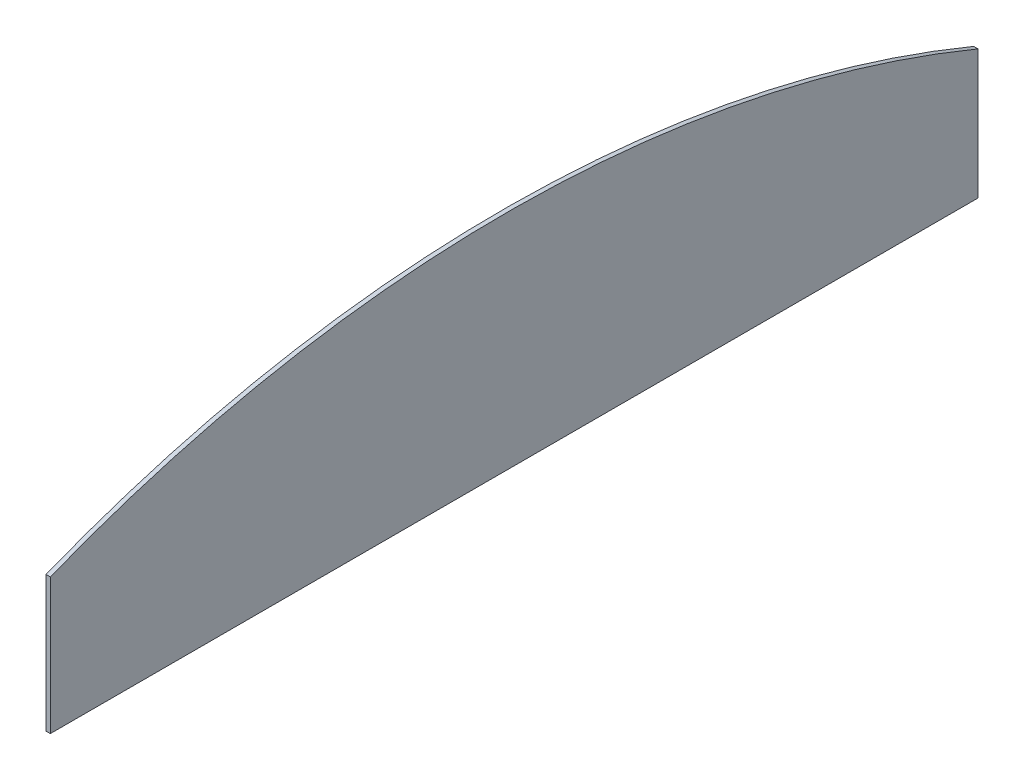
ISO-10303-21;
HEADER;
FILE_DESCRIPTION(('STEP AP214'),'2;1');
FILE_NAME('part.step','',(''),(''),'','','');
FILE_SCHEMA(('AUTOMOTIVE_DESIGN { 1 0 10303 214 1 1 1 1 }'));
ENDSEC;
DATA;
#1=APPLICATION_CONTEXT('core data for automotive mechanical design processes');
#2=APPLICATION_PROTOCOL_DEFINITION('international standard','automotive_design',2000,#1);
#3=PRODUCT_CONTEXT('',#1,'mechanical');
#4=PRODUCT('Part','Part','',(#3));
#5=PRODUCT_RELATED_PRODUCT_CATEGORY('part','',(#4));
#6=PRODUCT_DEFINITION_FORMATION('','',#4);
#7=PRODUCT_DEFINITION_CONTEXT('part definition',#1,'design');
#8=PRODUCT_DEFINITION('design','',#6,#7);
#9=PRODUCT_DEFINITION_SHAPE('','',#8);
#10=(LENGTH_UNIT() NAMED_UNIT(*) SI_UNIT(.MILLI.,.METRE.));
#11=(NAMED_UNIT(*) PLANE_ANGLE_UNIT() SI_UNIT($,.RADIAN.));
#12=(NAMED_UNIT(*) SI_UNIT($,.STERADIAN.) SOLID_ANGLE_UNIT());
#13=UNCERTAINTY_MEASURE_WITH_UNIT(LENGTH_MEASURE(1.E-05),#10,'distance_accuracy_value','');
#14=(GEOMETRIC_REPRESENTATION_CONTEXT(3) GLOBAL_UNCERTAINTY_ASSIGNED_CONTEXT((#13)) GLOBAL_UNIT_ASSIGNED_CONTEXT((#10,
#11,#12)) REPRESENTATION_CONTEXT('',''));
#15=CARTESIAN_POINT('',(0.,0.,0.));
#16=DIRECTION('',(0.,0.,1.));
#17=DIRECTION('',(1.,0.,0.));
#18=AXIS2_PLACEMENT_3D('',#15,#16,#17);
#19=CARTESIAN_POINT('',(1.5,348.032089202536,-162.774566473988));
#20=DIRECTION('',(0.,0.,1.));
#21=DIRECTION('',(0.,-1.,0.));
#22=AXIS2_PLACEMENT_3D('',#19,#20,#21);
#23=PLANE('',#22);
#24=DIRECTION('',(0.,1.,0.));
#25=VECTOR('',#24,1.);
#26=CARTESIAN_POINT('',(0.,348.032089202536,-162.774566473988));
#27=LINE('',#26,#25);
#28=CARTESIAN_POINT('',(0.,348.032089202536,-162.774566473988));
#29=VERTEX_POINT('',#28);
#30=CARTESIAN_POINT('',(0.,392.593225246189,-162.774566473988));
#31=VERTEX_POINT('',#30);
#32=EDGE_CURVE('E95',#29,#31,#27,.T.);
#33=ORIENTED_EDGE('',*,*,#32,.T.);
#34=DIRECTION('',(-1.,0.,0.));
#35=VECTOR('',#34,1.);
#36=CARTESIAN_POINT('',(1.5,392.593225246189,-162.774566473988));
#37=LINE('',#36,#35);
#38=CARTESIAN_POINT('',(1.5,392.593225246189,-162.774566473988));
#39=VERTEX_POINT('',#38);
#40=EDGE_CURVE('E11',#39,#31,#37,.T.);
#41=ORIENTED_EDGE('',*,*,#40,.F.);
#42=DIRECTION('',(0.,1.,0.));
#43=VECTOR('',#42,1.);
#44=CARTESIAN_POINT('',(1.5,348.032089202536,-162.774566473988));
#45=LINE('',#44,#43);
#46=CARTESIAN_POINT('',(1.5,348.032089202536,-162.774566473988));
#47=VERTEX_POINT('',#46);
#48=EDGE_CURVE('E83',#47,#39,#45,.T.);
#49=ORIENTED_EDGE('',*,*,#48,.F.);
#50=DIRECTION('',(-1.,0.,0.));
#51=VECTOR('',#50,1.);
#52=CARTESIAN_POINT('',(1.5,348.032089202536,-162.774566473988));
#53=LINE('',#52,#51);
#54=EDGE_CURVE('E91',#47,#29,#53,.T.);
#55=ORIENTED_EDGE('',*,*,#54,.T.);
#56=EDGE_LOOP('',(#33,#41,#49,#55));
#57=FACE_BOUND('',#56,.T.);
#58=ADVANCED_FACE('F32',(#57),#23,.F.);
#59=CARTESIAN_POINT('',(1.5,0.,0.));
#60=DIRECTION('',(-1.,0.,0.));
#61=DIRECTION('',(0.,0.,1.));
#62=AXIS2_PLACEMENT_3D('',#59,#60,#61);
#63=CYLINDRICAL_SURFACE('',#62,425.);
#64=CARTESIAN_POINT('',(0.,0.,0.));
#65=DIRECTION('',(1.,0.,0.));
#66=DIRECTION('',(0.,0.,-1.));
#67=AXIS2_PLACEMENT_3D('',#64,#65,#66);
#68=CIRCLE('',#67,425.);
#69=CARTESIAN_POINT('',(0.,394.848278522976,157.225433526012));
#70=VERTEX_POINT('',#69);
#71=EDGE_CURVE('E87',#31,#70,#68,.T.);
#72=ORIENTED_EDGE('',*,*,#71,.T.);
#73=DIRECTION('',(-1.,0.,0.));
#74=VECTOR('',#73,1.);
#75=CARTESIAN_POINT('',(1.5,394.848278522976,157.225433526012));
#76=LINE('',#75,#74);
#77=CARTESIAN_POINT('',(1.5,394.848278522976,157.225433526012));
#78=VERTEX_POINT('',#77);
#79=EDGE_CURVE('E40',#78,#70,#76,.T.);
#80=ORIENTED_EDGE('',*,*,#79,.F.);
#81=CARTESIAN_POINT('',(1.5,0.,0.));
#82=DIRECTION('',(1.,0.,0.));
#83=DIRECTION('',(0.,0.,-1.));
#84=AXIS2_PLACEMENT_3D('',#81,#82,#83);
#85=CIRCLE('',#84,425.);
#86=EDGE_CURVE('E78',#39,#78,#85,.T.);
#87=ORIENTED_EDGE('',*,*,#86,.F.);
#88=ORIENTED_EDGE('',*,*,#40,.T.);
#89=EDGE_LOOP('',(#72,#80,#87,#88));
#90=FACE_BOUND('',#89,.T.);
#91=ADVANCED_FACE('F86',(#90),#63,.T.);
#92=CARTESIAN_POINT('',(1.5,348.032089202536,157.225433526012));
#93=DIRECTION('',(0.,0.,-1.));
#94=DIRECTION('',(-1.,0.,0.));
#95=AXIS2_PLACEMENT_3D('',#92,#93,#94);
#96=PLANE('',#95);
#97=DIRECTION('',(0.,-1.,0.));
#98=VECTOR('',#97,1.);
#99=CARTESIAN_POINT('',(0.,348.032089202536,157.225433526012));
#100=LINE('',#99,#98);
#101=CARTESIAN_POINT('',(0.,348.032089202536,157.225433526012));
#102=VERTEX_POINT('',#101);
#103=EDGE_CURVE('E65',#70,#102,#100,.T.);
#104=ORIENTED_EDGE('',*,*,#103,.T.);
#105=DIRECTION('',(-1.,0.,0.));
#106=VECTOR('',#105,1.);
#107=CARTESIAN_POINT('',(1.5,348.032089202536,157.225433526012));
#108=LINE('',#107,#106);
#109=CARTESIAN_POINT('',(1.5,348.032089202536,157.225433526012));
#110=VERTEX_POINT('',#109);
#111=EDGE_CURVE('E88',#110,#102,#108,.T.);
#112=ORIENTED_EDGE('',*,*,#111,.F.);
#113=DIRECTION('',(0.,-1.,0.));
#114=VECTOR('',#113,1.);
#115=CARTESIAN_POINT('',(1.5,348.032089202536,157.225433526012));
#116=LINE('',#115,#114);
#117=EDGE_CURVE('E81',#78,#110,#116,.T.);
#118=ORIENTED_EDGE('',*,*,#117,.F.);
#119=ORIENTED_EDGE('',*,*,#79,.T.);
#120=EDGE_LOOP('',(#104,#112,#118,#119));
#121=FACE_BOUND('',#120,.T.);
#122=ADVANCED_FACE('F89',(#121),#96,.F.);
#123=CARTESIAN_POINT('',(1.5,348.032089202536,-162.774566473988));
#124=DIRECTION('',(0.,1.,0.));
#125=DIRECTION('',(0.,0.,1.));
#126=AXIS2_PLACEMENT_3D('',#123,#124,#125);
#127=PLANE('',#126);
#128=DIRECTION('',(0.,0.,-1.));
#129=VECTOR('',#128,1.);
#130=CARTESIAN_POINT('',(0.,348.032089202536,-162.774566473988));
#131=LINE('',#130,#129);
#132=EDGE_CURVE('E71',#102,#29,#131,.T.);
#133=ORIENTED_EDGE('',*,*,#132,.T.);
#134=ORIENTED_EDGE('',*,*,#54,.F.);
#135=DIRECTION('',(0.,0.,-1.));
#136=VECTOR('',#135,1.);
#137=CARTESIAN_POINT('',(1.5,348.032089202536,-162.774566473988));
#138=LINE('',#137,#136);
#139=EDGE_CURVE('E48',#110,#47,#138,.T.);
#140=ORIENTED_EDGE('',*,*,#139,.F.);
#141=ORIENTED_EDGE('',*,*,#111,.T.);
#142=EDGE_LOOP('',(#133,#134,#140,#141));
#143=FACE_BOUND('',#142,.T.);
#144=ADVANCED_FACE('F102',(#143),#127,.F.);
#145=CARTESIAN_POINT('',(1.5,0.,0.));
#146=DIRECTION('',(1.,0.,0.));
#147=DIRECTION('',(0.,0.,-1.));
#148=AXIS2_PLACEMENT_3D('',#145,#146,#147);
#149=PLANE('',#148);
#150=ORIENTED_EDGE('',*,*,#48,.T.);
#151=ORIENTED_EDGE('',*,*,#86,.T.);
#152=ORIENTED_EDGE('',*,*,#117,.T.);
#153=ORIENTED_EDGE('',*,*,#139,.T.);
#154=EDGE_LOOP('',(#150,#151,#152,#153));
#155=FACE_BOUND('',#154,.T.);
#156=ADVANCED_FACE('F79',(#155),#149,.T.);
#157=CARTESIAN_POINT('',(0.,0.,0.));
#158=DIRECTION('',(1.,0.,0.));
#159=DIRECTION('',(0.,0.,-1.));
#160=AXIS2_PLACEMENT_3D('',#157,#158,#159);
#161=PLANE('',#160);
#162=ORIENTED_EDGE('',*,*,#32,.F.);
#163=ORIENTED_EDGE('',*,*,#132,.F.);
#164=ORIENTED_EDGE('',*,*,#103,.F.);
#165=ORIENTED_EDGE('',*,*,#71,.F.);
#166=EDGE_LOOP('',(#162,#163,#164,#165));
#167=FACE_BOUND('',#166,.T.);
#168=ADVANCED_FACE('F105',(#167),#161,.F.);
#169=CLOSED_SHELL('',(#58,#91,#122,#144,#156,#168));
#170=MANIFOLD_SOLID_BREP('B2',#169);
#171=ADVANCED_BREP_SHAPE_REPRESENTATION('',(#18,#170),#14);
#172=SHAPE_DEFINITION_REPRESENTATION(#9,#171);
ENDSEC;
END-ISO-10303-21;
